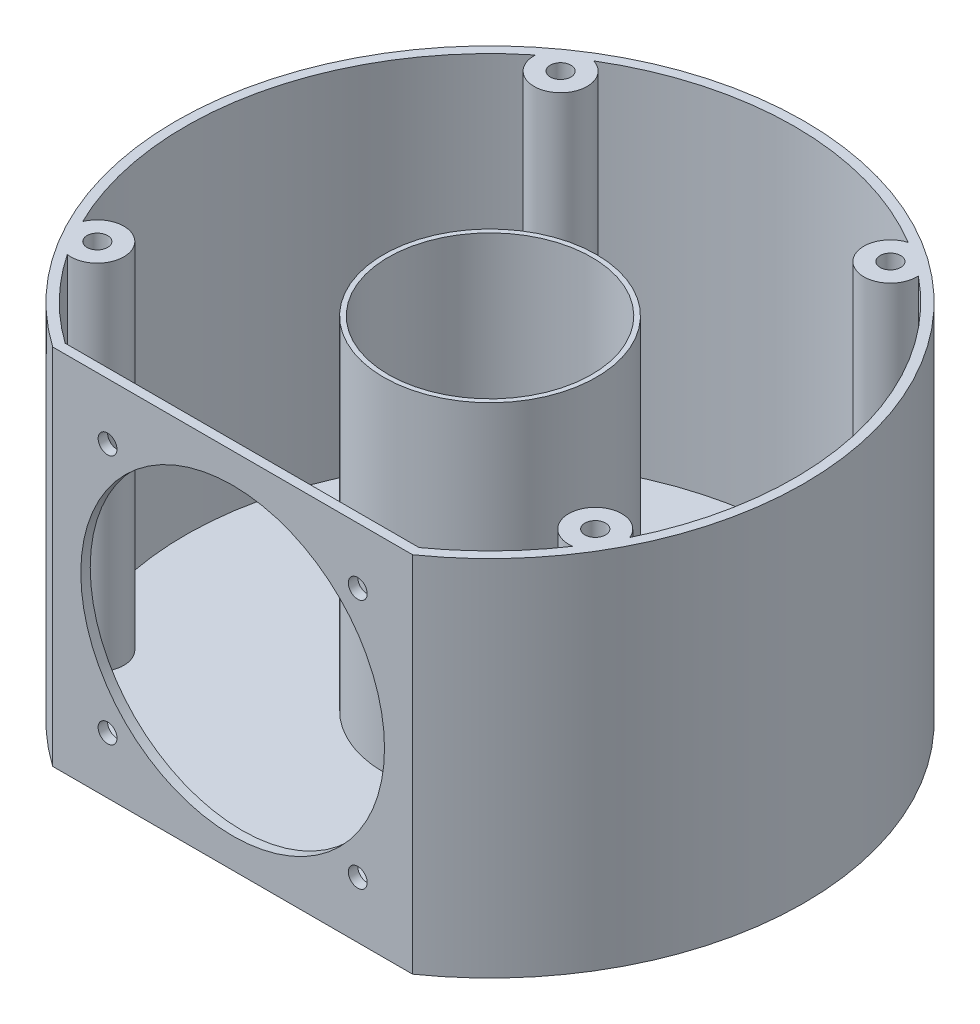
ISO-10303-21;
HEADER;
FILE_DESCRIPTION(('STEP AP214'),'2;1');
FILE_NAME('part.step','',(''),(''),'','','');
FILE_SCHEMA(('AUTOMOTIVE_DESIGN { 1 0 10303 214 1 1 1 1 }'));
ENDSEC;
DATA;
#1=APPLICATION_CONTEXT('core data for automotive mechanical design processes');
#2=APPLICATION_PROTOCOL_DEFINITION('international standard','automotive_design',2000,#1);
#3=PRODUCT_CONTEXT('',#1,'mechanical');
#4=PRODUCT('Part','Part','',(#3));
#5=PRODUCT_RELATED_PRODUCT_CATEGORY('part','',(#4));
#6=PRODUCT_DEFINITION_FORMATION('','',#4);
#7=PRODUCT_DEFINITION_CONTEXT('part definition',#1,'design');
#8=PRODUCT_DEFINITION('design','',#6,#7);
#9=PRODUCT_DEFINITION_SHAPE('','',#8);
#10=(LENGTH_UNIT() NAMED_UNIT(*) SI_UNIT(.MILLI.,.METRE.));
#11=(NAMED_UNIT(*) PLANE_ANGLE_UNIT() SI_UNIT($,.RADIAN.));
#12=(NAMED_UNIT(*) SI_UNIT($,.STERADIAN.) SOLID_ANGLE_UNIT());
#13=UNCERTAINTY_MEASURE_WITH_UNIT(LENGTH_MEASURE(1.E-05),#10,'distance_accuracy_value','');
#14=(GEOMETRIC_REPRESENTATION_CONTEXT(3) GLOBAL_UNCERTAINTY_ASSIGNED_CONTEXT((#13)) GLOBAL_UNIT_ASSIGNED_CONTEXT((#10,
#11,#12)) REPRESENTATION_CONTEXT('',''));
#15=CARTESIAN_POINT('',(0.,0.,0.));
#16=DIRECTION('',(0.,0.,1.));
#17=DIRECTION('',(1.,0.,0.));
#18=AXIS2_PLACEMENT_3D('',#15,#16,#17);
#19=CARTESIAN_POINT('',(0.,1.6,0.));
#20=DIRECTION('',(0.,-1.,0.));
#21=DIRECTION('',(0.,0.,-1.));
#22=AXIS2_PLACEMENT_3D('',#19,#20,#21);
#23=CYLINDRICAL_SURFACE('',#22,17.2417135288679);
#24=CARTESIAN_POINT('',(0.,0.,0.));
#25=DIRECTION('',(0.,1.,0.));
#26=DIRECTION('',(0.,0.,1.));
#27=AXIS2_PLACEMENT_3D('',#24,#25,#26);
#28=CIRCLE('',#27,17.2417135288679);
#29=CARTESIAN_POINT('',(0.,0.,17.2417135288679));
#30=VERTEX_POINT('',#29);
#31=EDGE_CURVE('E248',#30,#30,#28,.T.);
#32=ORIENTED_EDGE('',*,*,#31,.F.);
#33=EDGE_LOOP('',(#32));
#34=FACE_BOUND('',#33,.T.);
#35=CARTESIAN_POINT('',(0.,59.6,0.));
#36=DIRECTION('',(0.,1.,0.));
#37=DIRECTION('',(0.,0.,1.));
#38=AXIS2_PLACEMENT_3D('',#35,#36,#37);
#39=CIRCLE('',#38,17.2417135288679);
#40=CARTESIAN_POINT('',(0.,59.6,17.2417135288679));
#41=VERTEX_POINT('',#40);
#42=EDGE_CURVE('E314',#41,#41,#39,.T.);
#43=ORIENTED_EDGE('',*,*,#42,.T.);
#44=EDGE_LOOP('',(#43));
#45=FACE_BOUND('',#44,.T.);
#46=ADVANCED_FACE('F45',(#34,#45),#23,.F.);
#47=CARTESIAN_POINT('',(0.,61.6,0.));
#48=DIRECTION('',(0.,-1.,0.));
#49=DIRECTION('',(0.,0.,-1.));
#50=AXIS2_PLACEMENT_3D('',#47,#48,#49);
#51=CYLINDRICAL_SURFACE('',#50,18.0417135288679);
#52=CARTESIAN_POINT('',(0.,1.6,0.));
#53=DIRECTION('',(0.,1.,0.));
#54=DIRECTION('',(0.,0.,1.));
#55=AXIS2_PLACEMENT_3D('',#52,#53,#54);
#56=CIRCLE('',#55,18.0417135288679);
#57=CARTESIAN_POINT('',(0.,1.6,18.0417135288679));
#58=VERTEX_POINT('',#57);
#59=EDGE_CURVE('E223',#58,#58,#56,.T.);
#60=ORIENTED_EDGE('',*,*,#59,.T.);
#61=EDGE_LOOP('',(#60));
#62=FACE_BOUND('',#61,.T.);
#63=CARTESIAN_POINT('',(0.,59.6,0.));
#64=DIRECTION('',(0.,1.,0.));
#65=DIRECTION('',(0.,0.,1.));
#66=AXIS2_PLACEMENT_3D('',#63,#64,#65);
#67=CIRCLE('',#66,18.0417135288679);
#68=CARTESIAN_POINT('',(0.,59.6,18.0417135288679));
#69=VERTEX_POINT('',#68);
#70=EDGE_CURVE('E318',#69,#69,#67,.T.);
#71=ORIENTED_EDGE('',*,*,#70,.F.);
#72=EDGE_LOOP('',(#71));
#73=FACE_BOUND('',#72,.T.);
#74=ADVANCED_FACE('F304',(#62,#73),#51,.T.);
#75=CARTESIAN_POINT('',(-27.9606473281638,61.601,-39.9319427489363));
#76=DIRECTION('',(0.,-1.,0.));
#77=DIRECTION('',(0.,0.,-1.));
#78=AXIS2_PLACEMENT_3D('',#75,#76,#77);
#79=CYLINDRICAL_SURFACE('',#78,3.25);
#80=CARTESIAN_POINT('',(-27.9606473281638,0.,-39.9319427489363));
#81=DIRECTION('',(0.,1.,0.));
#82=DIRECTION('',(0.,0.,1.));
#83=AXIS2_PLACEMENT_3D('',#80,#81,#82);
#84=CIRCLE('',#83,3.25);
#85=CARTESIAN_POINT('',(-27.9606473281638,0.,-36.6819427489363));
#86=VERTEX_POINT('',#85);
#87=EDGE_CURVE('E256',#86,#86,#84,.T.);
#88=ORIENTED_EDGE('',*,*,#87,.F.);
#89=EDGE_LOOP('',(#88));
#90=FACE_BOUND('',#89,.T.);
#91=CARTESIAN_POINT('',(-27.9606473281638,57.6,-39.9319427489363));
#92=DIRECTION('',(0.,1.,0.));
#93=DIRECTION('',(0.,0.,1.));
#94=AXIS2_PLACEMENT_3D('',#91,#92,#93);
#95=CIRCLE('',#94,3.25);
#96=CARTESIAN_POINT('',(-27.9606473281638,57.6,-36.6819427489363));
#97=VERTEX_POINT('',#96);
#98=EDGE_CURVE('E49',#97,#97,#95,.T.);
#99=ORIENTED_EDGE('',*,*,#98,.T.);
#100=EDGE_LOOP('',(#99));
#101=FACE_BOUND('',#100,.T.);
#102=ADVANCED_FACE('F300',(#90,#101),#79,.F.);
#103=CARTESIAN_POINT('',(27.9606473281638,61.601,-39.9319427489363));
#104=DIRECTION('',(0.,-1.,0.));
#105=DIRECTION('',(0.,0.,-1.));
#106=AXIS2_PLACEMENT_3D('',#103,#104,#105);
#107=CYLINDRICAL_SURFACE('',#106,3.25);
#108=CARTESIAN_POINT('',(27.9606473281638,0.,-39.9319427489363));
#109=DIRECTION('',(0.,1.,0.));
#110=DIRECTION('',(0.,0.,1.));
#111=AXIS2_PLACEMENT_3D('',#108,#109,#110);
#112=CIRCLE('',#111,3.25);
#113=CARTESIAN_POINT('',(27.9606473281638,0.,-36.6819427489363));
#114=VERTEX_POINT('',#113);
#115=EDGE_CURVE('E292',#114,#114,#112,.T.);
#116=ORIENTED_EDGE('',*,*,#115,.F.);
#117=EDGE_LOOP('',(#116));
#118=FACE_BOUND('',#117,.T.);
#119=CARTESIAN_POINT('',(27.9606473281638,57.6,-39.9319427489363));
#120=DIRECTION('',(0.,1.,0.));
#121=DIRECTION('',(0.,0.,1.));
#122=AXIS2_PLACEMENT_3D('',#119,#120,#121);
#123=CIRCLE('',#122,3.25);
#124=CARTESIAN_POINT('',(27.9606473281638,57.6,-36.6819427489363));
#125=VERTEX_POINT('',#124);
#126=EDGE_CURVE('E262',#125,#125,#123,.T.);
#127=ORIENTED_EDGE('',*,*,#126,.T.);
#128=EDGE_LOOP('',(#127));
#129=FACE_BOUND('',#128,.T.);
#130=ADVANCED_FACE('F303',(#118,#129),#107,.F.);
#131=CARTESIAN_POINT('',(42.2169206365848,61.601,24.3739504938896));
#132=DIRECTION('',(0.,-1.,0.));
#133=DIRECTION('',(0.,0.,-1.));
#134=AXIS2_PLACEMENT_3D('',#131,#132,#133);
#135=CYLINDRICAL_SURFACE('',#134,3.25);
#136=CARTESIAN_POINT('',(42.2169206365848,0.,24.3739504938896));
#137=DIRECTION('',(0.,1.,0.));
#138=DIRECTION('',(0.,0.,1.));
#139=AXIS2_PLACEMENT_3D('',#136,#137,#138);
#140=CIRCLE('',#139,3.25);
#141=CARTESIAN_POINT('',(42.2169206365848,0.,27.6239504938896));
#142=VERTEX_POINT('',#141);
#143=EDGE_CURVE('E289',#142,#142,#140,.T.);
#144=ORIENTED_EDGE('',*,*,#143,.F.);
#145=EDGE_LOOP('',(#144));
#146=FACE_BOUND('',#145,.T.);
#147=CARTESIAN_POINT('',(42.2169206365848,57.6,24.3739504938896));
#148=DIRECTION('',(0.,1.,0.));
#149=DIRECTION('',(0.,0.,1.));
#150=AXIS2_PLACEMENT_3D('',#147,#148,#149);
#151=CIRCLE('',#150,3.25);
#152=CARTESIAN_POINT('',(42.2169206365848,57.6,27.6239504938896));
#153=VERTEX_POINT('',#152);
#154=EDGE_CURVE('E258',#153,#153,#151,.T.);
#155=ORIENTED_EDGE('',*,*,#154,.T.);
#156=EDGE_LOOP('',(#155));
#157=FACE_BOUND('',#156,.T.);
#158=ADVANCED_FACE('F416',(#146,#157),#135,.F.);
#159=CARTESIAN_POINT('',(-42.2169206365848,61.601,24.3739504938896));
#160=DIRECTION('',(0.,-1.,0.));
#161=DIRECTION('',(0.,0.,-1.));
#162=AXIS2_PLACEMENT_3D('',#159,#160,#161);
#163=CYLINDRICAL_SURFACE('',#162,3.25);
#164=CARTESIAN_POINT('',(-42.2169206365848,0.,24.3739504938896));
#165=DIRECTION('',(0.,1.,0.));
#166=DIRECTION('',(0.,0.,1.));
#167=AXIS2_PLACEMENT_3D('',#164,#165,#166);
#168=CIRCLE('',#167,3.25);
#169=CARTESIAN_POINT('',(-42.2169206365848,0.,27.6239504938896));
#170=VERTEX_POINT('',#169);
#171=EDGE_CURVE('E160',#170,#170,#168,.T.);
#172=ORIENTED_EDGE('',*,*,#171,.F.);
#173=EDGE_LOOP('',(#172));
#174=FACE_BOUND('',#173,.T.);
#175=CARTESIAN_POINT('',(-42.2169206365848,57.6,24.3739504938896));
#176=DIRECTION('',(0.,1.,0.));
#177=DIRECTION('',(0.,0.,1.));
#178=AXIS2_PLACEMENT_3D('',#175,#176,#177);
#179=CIRCLE('',#178,3.25);
#180=CARTESIAN_POINT('',(-42.2169206365848,57.6,27.6239504938896));
#181=VERTEX_POINT('',#180);
#182=EDGE_CURVE('E253',#181,#181,#179,.T.);
#183=ORIENTED_EDGE('',*,*,#182,.T.);
#184=EDGE_LOOP('',(#183));
#185=FACE_BOUND('',#184,.T.);
#186=ADVANCED_FACE('F413',(#174,#185),#163,.F.);
#187=CARTESIAN_POINT('',(0.,61.6,0.));
#188=DIRECTION('',(0.,-1.,0.));
#189=DIRECTION('',(0.,0.,-1.));
#190=AXIS2_PLACEMENT_3D('',#187,#188,#189);
#191=CYLINDRICAL_SURFACE('',#190,51.6479009877787);
#192=DIRECTION('',(0.,-1.,0.));
#193=VECTOR('',#192,1.);
#194=CARTESIAN_POINT('',(42.8533637080972,30.8,28.8287165053344));
#195=LINE('',#194,#193);
#196=CARTESIAN_POINT('',(42.8533637080972,1.6,28.8287165053343));
#197=VERTEX_POINT('',#196);
#198=CARTESIAN_POINT('',(42.8533637080972,61.6,28.8287165053343));
#199=VERTEX_POINT('',#198);
#200=EDGE_CURVE('E149',#197,#199,#195,.F.);
#201=ORIENTED_EDGE('',*,*,#200,.F.);
#202=CARTESIAN_POINT('',(0.,1.6,0.));
#203=DIRECTION('',(0.,1.,0.));
#204=DIRECTION('',(0.,0.,1.));
#205=AXIS2_PLACEMENT_3D('',#202,#203,#204);
#206=CIRCLE('',#205,51.6479009877787);
#207=CARTESIAN_POINT('',(30.,1.6,42.0417135288679));
#208=VERTEX_POINT('',#207);
#209=EDGE_CURVE('E136',#208,#197,#206,.T.);
#210=ORIENTED_EDGE('',*,*,#209,.F.);
#211=DIRECTION('',(0.,-1.,0.));
#212=VECTOR('',#211,1.);
#213=CARTESIAN_POINT('',(30.,61.6,42.0417135288679));
#214=LINE('',#213,#212);
#215=CARTESIAN_POINT('',(30.,61.6,42.0417135288679));
#216=VERTEX_POINT('',#215);
#217=EDGE_CURVE('E241',#216,#208,#214,.T.);
#218=ORIENTED_EDGE('',*,*,#217,.F.);
#219=CARTESIAN_POINT('',(0.,61.6,0.));
#220=DIRECTION('',(0.,1.,0.));
#221=DIRECTION('',(0.,0.,1.));
#222=AXIS2_PLACEMENT_3D('',#219,#220,#221);
#223=CIRCLE('',#222,51.6479009877787);
#224=EDGE_CURVE('E152',#216,#199,#223,.T.);
#225=ORIENTED_EDGE('',*,*,#224,.T.);
#226=EDGE_LOOP('',(#201,#210,#218,#225));
#227=FACE_BOUND('',#226,.T.);
#228=ADVANCED_FACE('F150',(#227),#191,.F.);
#229=DIRECTION('',(0.,-1.,0.));
#230=VECTOR('',#229,1.);
#231=CARTESIAN_POINT('',(46.3930827061677,30.8,22.6977433561595));
#232=LINE('',#231,#230);
#233=CARTESIAN_POINT('',(46.3930827061677,61.6,22.6977433561595));
#234=VERTEX_POINT('',#233);
#235=CARTESIAN_POINT('',(46.3930827061677,1.6,22.6977433561595));
#236=VERTEX_POINT('',#235);
#237=EDGE_CURVE('E62',#234,#236,#232,.T.);
#238=ORIENTED_EDGE('',*,*,#237,.F.);
#239=CARTESIAN_POINT('',(32.4539312786187,61.6,-40.1777055219196));
#240=VERTEX_POINT('',#239);
#241=EDGE_CURVE('E228',#234,#240,#223,.T.);
#242=ORIENTED_EDGE('',*,*,#241,.T.);
#243=DIRECTION('',(0.,-1.,0.));
#244=VECTOR('',#243,1.);
#245=CARTESIAN_POINT('',(32.4539312786187,30.8,-40.1777055219196));
#246=LINE('',#245,#244);
#247=CARTESIAN_POINT('',(32.4539312786187,1.6,-40.1777055219196));
#248=VERTEX_POINT('',#247);
#249=EDGE_CURVE('E171',#248,#240,#246,.F.);
#250=ORIENTED_EDGE('',*,*,#249,.F.);
#251=EDGE_CURVE('E145',#236,#248,#206,.T.);
#252=ORIENTED_EDGE('',*,*,#251,.F.);
#253=EDGE_LOOP('',(#238,#242,#250,#252));
#254=FACE_BOUND('',#253,.T.);
#255=ADVANCED_FACE('F503',(#254),#191,.F.);
#256=DIRECTION('',(0.,-1.,0.));
#257=VECTOR('',#256,1.);
#258=CARTESIAN_POINT('',(26.6547951716627,30.8,-44.2383043391144));
#259=LINE('',#258,#257);
#260=CARTESIAN_POINT('',(26.6547951716627,61.6,-44.2383043391144));
#261=VERTEX_POINT('',#260);
#262=CARTESIAN_POINT('',(26.6547951716627,1.6,-44.2383043391144));
#263=VERTEX_POINT('',#262);
#264=EDGE_CURVE('E169',#261,#263,#259,.T.);
#265=ORIENTED_EDGE('',*,*,#264,.F.);
#266=CARTESIAN_POINT('',(-26.6547951716627,61.6,-44.2383043391144));
#267=VERTEX_POINT('',#266);
#268=EDGE_CURVE('E487',#261,#267,#223,.T.);
#269=ORIENTED_EDGE('',*,*,#268,.T.);
#270=DIRECTION('',(0.,-1.,0.));
#271=VECTOR('',#270,1.);
#272=CARTESIAN_POINT('',(-26.6547951716627,30.8,-44.2383043391144));
#273=LINE('',#272,#271);
#274=CARTESIAN_POINT('',(-26.6547951716627,1.6,-44.2383043391144));
#275=VERTEX_POINT('',#274);
#276=EDGE_CURVE('E181',#275,#267,#273,.F.);
#277=ORIENTED_EDGE('',*,*,#276,.F.);
#278=EDGE_CURVE('E500',#263,#275,#206,.T.);
#279=ORIENTED_EDGE('',*,*,#278,.F.);
#280=EDGE_LOOP('',(#265,#269,#277,#279));
#281=FACE_BOUND('',#280,.T.);
#282=ADVANCED_FACE('F463',(#281),#191,.F.);
#283=DIRECTION('',(0.,-1.,0.));
#284=VECTOR('',#283,1.);
#285=CARTESIAN_POINT('',(-32.4539312786187,30.8,-40.1777055219196));
#286=LINE('',#285,#284);
#287=CARTESIAN_POINT('',(-32.4539312786187,61.6,-40.1777055219196));
#288=VERTEX_POINT('',#287);
#289=CARTESIAN_POINT('',(-32.4539312786187,1.6,-40.1777055219196));
#290=VERTEX_POINT('',#289);
#291=EDGE_CURVE('E179',#288,#290,#286,.T.);
#292=ORIENTED_EDGE('',*,*,#291,.F.);
#293=CARTESIAN_POINT('',(-46.3930827061677,61.6,22.6977433561595));
#294=VERTEX_POINT('',#293);
#295=EDGE_CURVE('E489',#288,#294,#223,.T.);
#296=ORIENTED_EDGE('',*,*,#295,.T.);
#297=DIRECTION('',(0.,-1.,0.));
#298=VECTOR('',#297,1.);
#299=CARTESIAN_POINT('',(-46.3930827061677,30.8,22.6977433561595));
#300=LINE('',#299,#298);
#301=CARTESIAN_POINT('',(-46.3930827061677,1.6,22.6977433561595));
#302=VERTEX_POINT('',#301);
#303=EDGE_CURVE('E191',#302,#294,#300,.F.);
#304=ORIENTED_EDGE('',*,*,#303,.F.);
#305=EDGE_CURVE('E498',#290,#302,#206,.T.);
#306=ORIENTED_EDGE('',*,*,#305,.F.);
#307=EDGE_LOOP('',(#292,#296,#304,#306));
#308=FACE_BOUND('',#307,.T.);
#309=ADVANCED_FACE('F349',(#308),#191,.F.);
#310=CARTESIAN_POINT('',(0.,1.6,43.6417135288679));
#311=DIRECTION('',(0.,0.,-1.));
#312=DIRECTION('',(-1.,0.,0.));
#313=AXIS2_PLACEMENT_3D('',#310,#311,#312);
#314=PLANE('',#313);
#315=CARTESIAN_POINT('',(0.,30.8,43.6417135288679));
#316=DIRECTION('',(0.,0.,1.));
#317=DIRECTION('',(1.,0.,0.));
#318=AXIS2_PLACEMENT_3D('',#315,#316,#317);
#319=CIRCLE('',#318,25.75);
#320=CARTESIAN_POINT('',(25.75,30.8,43.6417135288679));
#321=VERTEX_POINT('',#320);
#322=EDGE_CURVE('E196',#321,#321,#319,.T.);
#323=ORIENTED_EDGE('',*,*,#322,.F.);
#324=EDGE_LOOP('',(#323));
#325=FACE_BOUND('',#324,.T.);
#326=CARTESIAN_POINT('',(21.2132034355964,9.58679656440358,43.6417135288679));
#327=DIRECTION('',(0.,0.,1.));
#328=DIRECTION('',(1.,0.,0.));
#329=AXIS2_PLACEMENT_3D('',#326,#327,#328);
#330=CIRCLE('',#329,1.6);
#331=CARTESIAN_POINT('',(22.8132034355964,9.58679656440358,43.6417135288679));
#332=VERTEX_POINT('',#331);
#333=EDGE_CURVE('E200',#332,#332,#330,.T.);
#334=ORIENTED_EDGE('',*,*,#333,.F.);
#335=EDGE_LOOP('',(#334));
#336=FACE_BOUND('',#335,.T.);
#337=CARTESIAN_POINT('',(-21.2132034355964,9.58679656440358,43.6417135288679));
#338=DIRECTION('',(0.,0.,1.));
#339=DIRECTION('',(1.,0.,0.));
#340=AXIS2_PLACEMENT_3D('',#337,#338,#339);
#341=CIRCLE('',#340,1.6);
#342=CARTESIAN_POINT('',(-19.6132034355964,9.58679656440358,43.6417135288679));
#343=VERTEX_POINT('',#342);
#344=EDGE_CURVE('E220',#343,#343,#341,.F.);
#345=ORIENTED_EDGE('',*,*,#344,.T.);
#346=EDGE_LOOP('',(#345));
#347=FACE_BOUND('',#346,.T.);
#348=DIRECTION('',(1.,0.,0.));
#349=VECTOR('',#348,1.);
#350=CARTESIAN_POINT('',(0.,0.,43.6417135288679));
#351=LINE('',#350,#349);
#352=CARTESIAN_POINT('',(-30.5080284493855,0.,43.6417135288679));
#353=VERTEX_POINT('',#352);
#354=CARTESIAN_POINT('',(30.5080284493855,0.,43.6417135288679));
#355=VERTEX_POINT('',#354);
#356=EDGE_CURVE('E243',#353,#355,#351,.T.);
#357=ORIENTED_EDGE('',*,*,#356,.T.);
#358=DIRECTION('',(0.,-1.,0.));
#359=VECTOR('',#358,1.);
#360=CARTESIAN_POINT('',(30.5080284493855,1.6,43.6417135288679));
#361=LINE('',#360,#359);
#362=CARTESIAN_POINT('',(30.5080284493855,61.6,43.6417135288679));
#363=VERTEX_POINT('',#362);
#364=EDGE_CURVE('E12',#363,#355,#361,.T.);
#365=ORIENTED_EDGE('',*,*,#364,.F.);
#366=DIRECTION('',(1.,0.,0.));
#367=VECTOR('',#366,1.);
#368=CARTESIAN_POINT('',(0.,61.6,43.6417135288679));
#369=LINE('',#368,#367);
#370=CARTESIAN_POINT('',(-30.5080284493855,61.6,43.6417135288679));
#371=VERTEX_POINT('',#370);
#372=EDGE_CURVE('E234',#371,#363,#369,.T.);
#373=ORIENTED_EDGE('',*,*,#372,.F.);
#374=DIRECTION('',(0.,-1.,0.));
#375=VECTOR('',#374,1.);
#376=CARTESIAN_POINT('',(-30.5080284493855,1.6,43.6417135288679));
#377=LINE('',#376,#375);
#378=EDGE_CURVE('E54',#371,#353,#377,.T.);
#379=ORIENTED_EDGE('',*,*,#378,.T.);
#380=EDGE_LOOP('',(#357,#365,#373,#379));
#381=FACE_BOUND('',#380,.T.);
#382=CARTESIAN_POINT('',(21.2132034355964,52.0132034355964,43.6417135288679));
#383=DIRECTION('',(0.,0.,1.));
#384=DIRECTION('',(1.,0.,0.));
#385=AXIS2_PLACEMENT_3D('',#382,#383,#384);
#386=CIRCLE('',#385,1.6);
#387=CARTESIAN_POINT('',(22.8132034355964,52.0132034355964,43.6417135288679));
#388=VERTEX_POINT('',#387);
#389=EDGE_CURVE('E207',#388,#388,#386,.F.);
#390=ORIENTED_EDGE('',*,*,#389,.T.);
#391=EDGE_LOOP('',(#390));
#392=FACE_BOUND('',#391,.T.);
#393=CARTESIAN_POINT('',(-21.2132034355964,52.0132034355964,43.6417135288679));
#394=DIRECTION('',(0.,0.,1.));
#395=DIRECTION('',(1.,0.,0.));
#396=AXIS2_PLACEMENT_3D('',#393,#394,#395);
#397=CIRCLE('',#396,1.6);
#398=CARTESIAN_POINT('',(-19.6132034355964,52.0132034355964,43.6417135288679));
#399=VERTEX_POINT('',#398);
#400=EDGE_CURVE('E211',#399,#399,#397,.T.);
#401=ORIENTED_EDGE('',*,*,#400,.F.);
#402=EDGE_LOOP('',(#401));
#403=FACE_BOUND('',#402,.T.);
#404=ADVANCED_FACE('F47',(#325,#336,#347,#381,#392,#403),#314,.F.);
#405=CARTESIAN_POINT('',(0.,61.6,42.0417135288679));
#406=DIRECTION('',(0.,0.,-1.));
#407=DIRECTION('',(-1.,0.,0.));
#408=AXIS2_PLACEMENT_3D('',#405,#406,#407);
#409=PLANE('',#408);
#410=CARTESIAN_POINT('',(0.,30.8,42.0417135288679));
#411=DIRECTION('',(0.,0.,-1.));
#412=DIRECTION('',(-1.,0.,0.));
#413=AXIS2_PLACEMENT_3D('',#410,#411,#412);
#414=CIRCLE('',#413,25.75);
#415=CARTESIAN_POINT('',(-25.75,30.8,42.0417135288679));
#416=VERTEX_POINT('',#415);
#417=EDGE_CURVE('E193',#416,#416,#414,.F.);
#418=ORIENTED_EDGE('',*,*,#417,.T.);
#419=EDGE_LOOP('',(#418));
#420=FACE_BOUND('',#419,.T.);
#421=CARTESIAN_POINT('',(21.2132034355964,52.0132034355964,42.0417135288679));
#422=DIRECTION('',(0.,0.,-1.));
#423=DIRECTION('',(-1.,0.,0.));
#424=AXIS2_PLACEMENT_3D('',#421,#422,#423);
#425=CIRCLE('',#424,1.6);
#426=CARTESIAN_POINT('',(19.6132034355964,52.0132034355964,42.0417135288679));
#427=VERTEX_POINT('',#426);
#428=EDGE_CURVE('E208',#427,#427,#425,.T.);
#429=ORIENTED_EDGE('',*,*,#428,.F.);
#430=EDGE_LOOP('',(#429));
#431=FACE_BOUND('',#430,.T.);
#432=CARTESIAN_POINT('',(-21.2132034355964,9.58679656440358,42.0417135288679));
#433=DIRECTION('',(0.,0.,-1.));
#434=DIRECTION('',(-1.,0.,0.));
#435=AXIS2_PLACEMENT_3D('',#432,#433,#434);
#436=CIRCLE('',#435,1.6);
#437=CARTESIAN_POINT('',(-22.8132034355964,9.58679656440358,42.0417135288679));
#438=VERTEX_POINT('',#437);
#439=EDGE_CURVE('E203',#438,#438,#436,.T.);
#440=ORIENTED_EDGE('',*,*,#439,.F.);
#441=EDGE_LOOP('',(#440));
#442=FACE_BOUND('',#441,.T.);
#443=DIRECTION('',(1.,0.,0.));
#444=VECTOR('',#443,1.);
#445=CARTESIAN_POINT('',(0.,1.6,42.0417135288679));
#446=LINE('',#445,#444);
#447=CARTESIAN_POINT('',(-30.,1.6,42.0417135288679));
#448=VERTEX_POINT('',#447);
#449=EDGE_CURVE('E142',#448,#208,#446,.T.);
#450=ORIENTED_EDGE('',*,*,#449,.F.);
#451=DIRECTION('',(0.,-1.,0.));
#452=VECTOR('',#451,1.);
#453=CARTESIAN_POINT('',(-30.,61.6,42.0417135288679));
#454=LINE('',#453,#452);
#455=CARTESIAN_POINT('',(-30.,61.6,42.0417135288679));
#456=VERTEX_POINT('',#455);
#457=EDGE_CURVE('E236',#456,#448,#454,.T.);
#458=ORIENTED_EDGE('',*,*,#457,.F.);
#459=DIRECTION('',(1.,0.,0.));
#460=VECTOR('',#459,1.);
#461=CARTESIAN_POINT('',(0.,61.6,42.0417135288679));
#462=LINE('',#461,#460);
#463=EDGE_CURVE('E227',#456,#216,#462,.T.);
#464=ORIENTED_EDGE('',*,*,#463,.T.);
#465=ORIENTED_EDGE('',*,*,#217,.T.);
#466=EDGE_LOOP('',(#450,#458,#464,#465));
#467=FACE_BOUND('',#466,.T.);
#468=CARTESIAN_POINT('',(21.2132034355964,9.58679656440358,42.0417135288679));
#469=DIRECTION('',(0.,0.,-1.));
#470=DIRECTION('',(-1.,0.,0.));
#471=AXIS2_PLACEMENT_3D('',#468,#469,#470);
#472=CIRCLE('',#471,1.6);
#473=CARTESIAN_POINT('',(19.6132034355964,9.58679656440358,42.0417135288679));
#474=VERTEX_POINT('',#473);
#475=EDGE_CURVE('E204',#474,#474,#472,.F.);
#476=ORIENTED_EDGE('',*,*,#475,.T.);
#477=EDGE_LOOP('',(#476));
#478=FACE_BOUND('',#477,.T.);
#479=CARTESIAN_POINT('',(-21.2132034355964,52.0132034355964,42.0417135288679));
#480=DIRECTION('',(0.,0.,-1.));
#481=DIRECTION('',(-1.,0.,0.));
#482=AXIS2_PLACEMENT_3D('',#479,#480,#481);
#483=CIRCLE('',#482,1.6);
#484=CARTESIAN_POINT('',(-22.8132034355964,52.0132034355964,42.0417135288679));
#485=VERTEX_POINT('',#484);
#486=EDGE_CURVE('E199',#485,#485,#483,.F.);
#487=ORIENTED_EDGE('',*,*,#486,.T.);
#488=EDGE_LOOP('',(#487));
#489=FACE_BOUND('',#488,.T.);
#490=ADVANCED_FACE('F341',(#420,#431,#442,#467,#478,#489),#409,.T.);
#491=CARTESIAN_POINT('',(0.,1.6,0.));
#492=DIRECTION('',(0.,-1.,0.));
#493=DIRECTION('',(0.,0.,-1.));
#494=AXIS2_PLACEMENT_3D('',#491,#492,#493);
#495=CYLINDRICAL_SURFACE('',#494,53.2479009877787);
#496=ORIENTED_EDGE('',*,*,#378,.F.);
#497=CARTESIAN_POINT('',(0.,61.6,0.));
#498=DIRECTION('',(0.,1.,0.));
#499=DIRECTION('',(0.,0.,1.));
#500=AXIS2_PLACEMENT_3D('',#497,#498,#499);
#501=CIRCLE('',#500,53.2479009877787);
#502=EDGE_CURVE('E232',#363,#371,#501,.T.);
#503=ORIENTED_EDGE('',*,*,#502,.F.);
#504=ORIENTED_EDGE('',*,*,#364,.T.);
#505=CARTESIAN_POINT('',(0.,0.,0.));
#506=DIRECTION('',(0.,1.,0.));
#507=DIRECTION('',(0.,0.,1.));
#508=AXIS2_PLACEMENT_3D('',#505,#506,#507);
#509=CIRCLE('',#508,53.2479009877787);
#510=EDGE_CURVE('E246',#355,#353,#509,.T.);
#511=ORIENTED_EDGE('',*,*,#510,.T.);
#512=EDGE_LOOP('',(#496,#503,#504,#511));
#513=FACE_BOUND('',#512,.T.);
#514=ADVANCED_FACE('F344',(#513),#495,.T.);
#515=CARTESIAN_POINT('',(0.,1.6,0.));
#516=DIRECTION('',(0.,1.,0.));
#517=DIRECTION('',(0.,0.,1.));
#518=AXIS2_PLACEMENT_3D('',#515,#516,#517);
#519=PLANE('',#518);
#520=CARTESIAN_POINT('',(42.2169206365848,1.6,24.3739504938896));
#521=DIRECTION('',(0.,1.,0.));
#522=DIRECTION('',(0.,0.,1.));
#523=AXIS2_PLACEMENT_3D('',#520,#521,#522);
#524=CIRCLE('',#523,4.5);
#525=EDGE_CURVE('E140',#236,#197,#524,.T.);
#526=ORIENTED_EDGE('',*,*,#525,.F.);
#527=ORIENTED_EDGE('',*,*,#251,.T.);
#528=CARTESIAN_POINT('',(27.9606473281638,1.6,-39.9319427489363));
#529=DIRECTION('',(0.,1.,0.));
#530=DIRECTION('',(0.,0.,1.));
#531=AXIS2_PLACEMENT_3D('',#528,#529,#530);
#532=CIRCLE('',#531,4.5);
#533=EDGE_CURVE('E166',#263,#248,#532,.T.);
#534=ORIENTED_EDGE('',*,*,#533,.F.);
#535=ORIENTED_EDGE('',*,*,#278,.T.);
#536=CARTESIAN_POINT('',(-27.9606473281638,1.6,-39.9319427489363));
#537=DIRECTION('',(0.,1.,0.));
#538=DIRECTION('',(0.,0.,1.));
#539=AXIS2_PLACEMENT_3D('',#536,#537,#538);
#540=CIRCLE('',#539,4.50000000000001);
#541=EDGE_CURVE('E176',#290,#275,#540,.T.);
#542=ORIENTED_EDGE('',*,*,#541,.F.);
#543=ORIENTED_EDGE('',*,*,#305,.T.);
#544=CARTESIAN_POINT('',(-42.2169206365848,1.6,24.3739504938896));
#545=DIRECTION('',(0.,1.,0.));
#546=DIRECTION('',(0.,0.,1.));
#547=AXIS2_PLACEMENT_3D('',#544,#545,#546);
#548=CIRCLE('',#547,4.5);
#549=CARTESIAN_POINT('',(-42.8533637080971,1.6,28.8287165053344));
#550=VERTEX_POINT('',#549);
#551=EDGE_CURVE('E188',#550,#302,#548,.T.);
#552=ORIENTED_EDGE('',*,*,#551,.F.);
#553=EDGE_CURVE('E147',#550,#448,#206,.T.);
#554=ORIENTED_EDGE('',*,*,#553,.T.);
#555=ORIENTED_EDGE('',*,*,#449,.T.);
#556=ORIENTED_EDGE('',*,*,#209,.T.);
#557=EDGE_LOOP('',(#526,#527,#534,#535,#542,#543,#552,#554,#555,#556));
#558=FACE_BOUND('',#557,.T.);
#559=ORIENTED_EDGE('',*,*,#59,.F.);
#560=EDGE_LOOP('',(#559));
#561=FACE_BOUND('',#560,.T.);
#562=ADVANCED_FACE('F138',(#558,#561),#519,.T.);
#563=CARTESIAN_POINT('',(0.,0.,0.));
#564=DIRECTION('',(0.,1.,0.));
#565=DIRECTION('',(0.,0.,1.));
#566=AXIS2_PLACEMENT_3D('',#563,#564,#565);
#567=PLANE('',#566);
#568=ORIENTED_EDGE('',*,*,#171,.T.);
#569=EDGE_LOOP('',(#568));
#570=FACE_BOUND('',#569,.T.);
#571=ORIENTED_EDGE('',*,*,#143,.T.);
#572=EDGE_LOOP('',(#571));
#573=FACE_BOUND('',#572,.T.);
#574=ORIENTED_EDGE('',*,*,#115,.T.);
#575=EDGE_LOOP('',(#574));
#576=FACE_BOUND('',#575,.T.);
#577=ORIENTED_EDGE('',*,*,#87,.T.);
#578=EDGE_LOOP('',(#577));
#579=FACE_BOUND('',#578,.T.);
#580=ORIENTED_EDGE('',*,*,#356,.F.);
#581=ORIENTED_EDGE('',*,*,#510,.F.);
#582=EDGE_LOOP('',(#580,#581));
#583=FACE_BOUND('',#582,.T.);
#584=ORIENTED_EDGE('',*,*,#31,.T.);
#585=EDGE_LOOP('',(#584));
#586=FACE_BOUND('',#585,.T.);
#587=ADVANCED_FACE('F297',(#570,#573,#576,#579,#583,#586),#567,.F.);
#588=DIRECTION('',(0.,-1.,0.));
#589=VECTOR('',#588,1.);
#590=CARTESIAN_POINT('',(-42.8533637080972,30.8,28.8287165053344));
#591=LINE('',#590,#589);
#592=CARTESIAN_POINT('',(-42.8533637080972,61.6,28.8287165053343));
#593=VERTEX_POINT('',#592);
#594=EDGE_CURVE('E186',#593,#550,#591,.T.);
#595=ORIENTED_EDGE('',*,*,#594,.F.);
#596=EDGE_CURVE('E229',#593,#456,#223,.T.);
#597=ORIENTED_EDGE('',*,*,#596,.T.);
#598=ORIENTED_EDGE('',*,*,#457,.T.);
#599=ORIENTED_EDGE('',*,*,#553,.F.);
#600=EDGE_LOOP('',(#595,#597,#598,#599));
#601=FACE_BOUND('',#600,.T.);
#602=ADVANCED_FACE('F339',(#601),#191,.F.);
#603=CARTESIAN_POINT('',(0.,61.6,0.));
#604=DIRECTION('',(0.,1.,0.));
#605=DIRECTION('',(0.,0.,1.));
#606=AXIS2_PLACEMENT_3D('',#603,#604,#605);
#607=PLANE('',#606);
#608=ORIENTED_EDGE('',*,*,#502,.T.);
#609=ORIENTED_EDGE('',*,*,#372,.T.);
#610=EDGE_LOOP('',(#608,#609));
#611=FACE_BOUND('',#610,.T.);
#612=CARTESIAN_POINT('',(-27.9606473281638,61.6,-39.9319427489363));
#613=DIRECTION('',(0.,1.,0.));
#614=DIRECTION('',(0.,0.,1.));
#615=AXIS2_PLACEMENT_3D('',#612,#613,#614);
#616=CIRCLE('',#615,4.50000000000001);
#617=EDGE_CURVE('E173',#267,#288,#616,.F.);
#618=ORIENTED_EDGE('',*,*,#617,.F.);
#619=ORIENTED_EDGE('',*,*,#268,.F.);
#620=CARTESIAN_POINT('',(27.9606473281638,61.6,-39.9319427489363));
#621=DIRECTION('',(0.,1.,0.));
#622=DIRECTION('',(0.,0.,1.));
#623=AXIS2_PLACEMENT_3D('',#620,#621,#622);
#624=CIRCLE('',#623,4.5);
#625=EDGE_CURVE('E154',#240,#261,#624,.F.);
#626=ORIENTED_EDGE('',*,*,#625,.F.);
#627=ORIENTED_EDGE('',*,*,#241,.F.);
#628=CARTESIAN_POINT('',(42.2169206365848,61.6,24.3739504938896));
#629=DIRECTION('',(0.,1.,0.));
#630=DIRECTION('',(0.,0.,1.));
#631=AXIS2_PLACEMENT_3D('',#628,#629,#630);
#632=CIRCLE('',#631,4.5);
#633=EDGE_CURVE('E157',#199,#234,#632,.F.);
#634=ORIENTED_EDGE('',*,*,#633,.F.);
#635=ORIENTED_EDGE('',*,*,#224,.F.);
#636=ORIENTED_EDGE('',*,*,#463,.F.);
#637=ORIENTED_EDGE('',*,*,#596,.F.);
#638=CARTESIAN_POINT('',(-42.2169206365848,61.6,24.3739504938896));
#639=DIRECTION('',(0.,1.,0.));
#640=DIRECTION('',(0.,0.,1.));
#641=AXIS2_PLACEMENT_3D('',#638,#639,#640);
#642=CIRCLE('',#641,4.5);
#643=EDGE_CURVE('E183',#294,#593,#642,.F.);
#644=ORIENTED_EDGE('',*,*,#643,.F.);
#645=ORIENTED_EDGE('',*,*,#295,.F.);
#646=EDGE_LOOP('',(#618,#619,#626,#627,#634,#635,#636,#637,#644,#645));
#647=FACE_BOUND('',#646,.T.);
#648=CARTESIAN_POINT('',(-42.2169206365848,61.6,24.3739504938896));
#649=DIRECTION('',(0.,1.,0.));
#650=DIRECTION('',(0.,0.,1.));
#651=AXIS2_PLACEMENT_3D('',#648,#649,#650);
#652=CIRCLE('',#651,1.75);
#653=CARTESIAN_POINT('',(-42.2169206365848,61.6,26.1239504938896));
#654=VERTEX_POINT('',#653);
#655=EDGE_CURVE('E260',#654,#654,#652,.T.);
#656=ORIENTED_EDGE('',*,*,#655,.F.);
#657=EDGE_LOOP('',(#656));
#658=FACE_BOUND('',#657,.T.);
#659=CARTESIAN_POINT('',(42.2169206365848,61.6,24.3739504938896));
#660=DIRECTION('',(0.,1.,0.));
#661=DIRECTION('',(0.,0.,1.));
#662=AXIS2_PLACEMENT_3D('',#659,#660,#661);
#663=CIRCLE('',#662,1.75);
#664=CARTESIAN_POINT('',(42.2169206365848,61.6,26.1239504938896));
#665=VERTEX_POINT('',#664);
#666=EDGE_CURVE('E264',#665,#665,#663,.T.);
#667=ORIENTED_EDGE('',*,*,#666,.F.);
#668=EDGE_LOOP('',(#667));
#669=FACE_BOUND('',#668,.T.);
#670=CARTESIAN_POINT('',(27.9606473281638,61.6,-39.9319427489363));
#671=DIRECTION('',(0.,1.,0.));
#672=DIRECTION('',(0.,0.,1.));
#673=AXIS2_PLACEMENT_3D('',#670,#671,#672);
#674=CIRCLE('',#673,1.75);
#675=CARTESIAN_POINT('',(27.9606473281638,61.6,-38.1819427489363));
#676=VERTEX_POINT('',#675);
#677=EDGE_CURVE('E271',#676,#676,#674,.T.);
#678=ORIENTED_EDGE('',*,*,#677,.F.);
#679=EDGE_LOOP('',(#678));
#680=FACE_BOUND('',#679,.T.);
#681=CARTESIAN_POINT('',(-27.9606473281638,61.6,-39.9319427489363));
#682=DIRECTION('',(0.,1.,0.));
#683=DIRECTION('',(0.,0.,1.));
#684=AXIS2_PLACEMENT_3D('',#681,#682,#683);
#685=CIRCLE('',#684,1.75);
#686=CARTESIAN_POINT('',(-27.9606473281638,61.6,-38.1819427489363));
#687=VERTEX_POINT('',#686);
#688=EDGE_CURVE('E278',#687,#687,#685,.T.);
#689=ORIENTED_EDGE('',*,*,#688,.F.);
#690=EDGE_LOOP('',(#689));
#691=FACE_BOUND('',#690,.T.);
#692=ADVANCED_FACE('F336',(#611,#647,#658,#669,#680,#691),#607,.T.);
#693=CARTESIAN_POINT('',(-21.2132034355964,9.58679656440358,-53.2489009877787));
#694=DIRECTION('',(0.,0.,1.));
#695=DIRECTION('',(1.,0.,0.));
#696=AXIS2_PLACEMENT_3D('',#693,#694,#695);
#697=CYLINDRICAL_SURFACE('',#696,1.6);
#698=ORIENTED_EDGE('',*,*,#439,.T.);
#699=EDGE_LOOP('',(#698));
#700=FACE_BOUND('',#699,.T.);
#701=ORIENTED_EDGE('',*,*,#344,.F.);
#702=EDGE_LOOP('',(#701));
#703=FACE_BOUND('',#702,.T.);
#704=ADVANCED_FACE('F334',(#700,#703),#697,.F.);
#705=CARTESIAN_POINT('',(21.2132034355964,9.58679656440358,-53.2489009877787));
#706=DIRECTION('',(0.,0.,1.));
#707=DIRECTION('',(1.,0.,0.));
#708=AXIS2_PLACEMENT_3D('',#705,#706,#707);
#709=CYLINDRICAL_SURFACE('',#708,1.6);
#710=ORIENTED_EDGE('',*,*,#475,.F.);
#711=EDGE_LOOP('',(#710));
#712=FACE_BOUND('',#711,.T.);
#713=ORIENTED_EDGE('',*,*,#333,.T.);
#714=EDGE_LOOP('',(#713));
#715=FACE_BOUND('',#714,.T.);
#716=ADVANCED_FACE('F443',(#712,#715),#709,.F.);
#717=CARTESIAN_POINT('',(21.2132034355964,52.0132034355964,-53.2489009877787));
#718=DIRECTION('',(0.,0.,1.));
#719=DIRECTION('',(1.,0.,0.));
#720=AXIS2_PLACEMENT_3D('',#717,#718,#719);
#721=CYLINDRICAL_SURFACE('',#720,1.6);
#722=ORIENTED_EDGE('',*,*,#428,.T.);
#723=EDGE_LOOP('',(#722));
#724=FACE_BOUND('',#723,.T.);
#725=ORIENTED_EDGE('',*,*,#389,.F.);
#726=EDGE_LOOP('',(#725));
#727=FACE_BOUND('',#726,.T.);
#728=ADVANCED_FACE('F446',(#724,#727),#721,.F.);
#729=CARTESIAN_POINT('',(-21.2132034355964,52.0132034355964,-53.2489009877787));
#730=DIRECTION('',(0.,0.,1.));
#731=DIRECTION('',(1.,0.,0.));
#732=AXIS2_PLACEMENT_3D('',#729,#730,#731);
#733=CYLINDRICAL_SURFACE('',#732,1.6);
#734=ORIENTED_EDGE('',*,*,#486,.F.);
#735=EDGE_LOOP('',(#734));
#736=FACE_BOUND('',#735,.T.);
#737=ORIENTED_EDGE('',*,*,#400,.T.);
#738=EDGE_LOOP('',(#737));
#739=FACE_BOUND('',#738,.T.);
#740=ADVANCED_FACE('F441',(#736,#739),#733,.F.);
#741=CARTESIAN_POINT('',(0.,30.8,-53.2489009877787));
#742=DIRECTION('',(0.,0.,1.));
#743=DIRECTION('',(1.,0.,0.));
#744=AXIS2_PLACEMENT_3D('',#741,#742,#743);
#745=CYLINDRICAL_SURFACE('',#744,25.75);
#746=ORIENTED_EDGE('',*,*,#417,.F.);
#747=EDGE_LOOP('',(#746));
#748=FACE_BOUND('',#747,.T.);
#749=ORIENTED_EDGE('',*,*,#322,.T.);
#750=EDGE_LOOP('',(#749));
#751=FACE_BOUND('',#750,.T.);
#752=ADVANCED_FACE('F437',(#748,#751),#745,.F.);
#753=CARTESIAN_POINT('',(-42.2169206365848,74.3279220613579,24.3739504938896));
#754=DIRECTION('',(0.,-1.,0.));
#755=DIRECTION('',(0.,0.,-1.));
#756=AXIS2_PLACEMENT_3D('',#753,#754,#755);
#757=CYLINDRICAL_SURFACE('',#756,4.5);
#758=ORIENTED_EDGE('',*,*,#594,.T.);
#759=ORIENTED_EDGE('',*,*,#551,.T.);
#760=ORIENTED_EDGE('',*,*,#303,.T.);
#761=ORIENTED_EDGE('',*,*,#643,.T.);
#762=EDGE_LOOP('',(#758,#759,#760,#761));
#763=FACE_BOUND('',#762,.T.);
#764=ADVANCED_FACE('F433',(#763),#757,.T.);
#765=CARTESIAN_POINT('',(-27.9606473281638,74.3279220613579,-39.9319427489363));
#766=DIRECTION('',(0.,-1.,0.));
#767=DIRECTION('',(0.,0.,-1.));
#768=AXIS2_PLACEMENT_3D('',#765,#766,#767);
#769=CYLINDRICAL_SURFACE('',#768,4.50000000000001);
#770=ORIENTED_EDGE('',*,*,#291,.T.);
#771=ORIENTED_EDGE('',*,*,#541,.T.);
#772=ORIENTED_EDGE('',*,*,#276,.T.);
#773=ORIENTED_EDGE('',*,*,#617,.T.);
#774=EDGE_LOOP('',(#770,#771,#772,#773));
#775=FACE_BOUND('',#774,.T.);
#776=ADVANCED_FACE('F429',(#775),#769,.T.);
#777=CARTESIAN_POINT('',(27.9606473281638,74.3279220613579,-39.9319427489363));
#778=DIRECTION('',(0.,-1.,0.));
#779=DIRECTION('',(0.,0.,-1.));
#780=AXIS2_PLACEMENT_3D('',#777,#778,#779);
#781=CYLINDRICAL_SURFACE('',#780,4.5);
#782=ORIENTED_EDGE('',*,*,#264,.T.);
#783=ORIENTED_EDGE('',*,*,#533,.T.);
#784=ORIENTED_EDGE('',*,*,#249,.T.);
#785=ORIENTED_EDGE('',*,*,#625,.T.);
#786=EDGE_LOOP('',(#782,#783,#784,#785));
#787=FACE_BOUND('',#786,.T.);
#788=ADVANCED_FACE('F426',(#787),#781,.T.);
#789=CARTESIAN_POINT('',(42.2169206365848,74.3279220613579,24.3739504938896));
#790=DIRECTION('',(0.,-1.,0.));
#791=DIRECTION('',(0.,0.,-1.));
#792=AXIS2_PLACEMENT_3D('',#789,#790,#791);
#793=CYLINDRICAL_SURFACE('',#792,4.5);
#794=ORIENTED_EDGE('',*,*,#237,.T.);
#795=ORIENTED_EDGE('',*,*,#525,.T.);
#796=ORIENTED_EDGE('',*,*,#200,.T.);
#797=ORIENTED_EDGE('',*,*,#633,.T.);
#798=EDGE_LOOP('',(#794,#795,#796,#797));
#799=FACE_BOUND('',#798,.T.);
#800=ADVANCED_FACE('F156',(#799),#793,.T.);
#801=CARTESIAN_POINT('',(-42.2169206365848,57.6,24.3739504938896));
#802=DIRECTION('',(0.,1.,0.));
#803=DIRECTION('',(0.,0.,1.));
#804=AXIS2_PLACEMENT_3D('',#801,#802,#803);
#805=PLANE('',#804);
#806=CARTESIAN_POINT('',(-42.2169206365848,57.6,24.3739504938896));
#807=DIRECTION('',(0.,1.,0.));
#808=DIRECTION('',(0.,0.,1.));
#809=AXIS2_PLACEMENT_3D('',#806,#807,#808);
#810=CIRCLE('',#809,1.75);
#811=CARTESIAN_POINT('',(-42.2169206365848,57.6,26.1239504938896));
#812=VERTEX_POINT('',#811);
#813=EDGE_CURVE('E257',#812,#812,#810,.T.);
#814=ORIENTED_EDGE('',*,*,#813,.T.);
#815=EDGE_LOOP('',(#814));
#816=FACE_BOUND('',#815,.T.);
#817=ORIENTED_EDGE('',*,*,#182,.F.);
#818=EDGE_LOOP('',(#817));
#819=FACE_BOUND('',#818,.T.);
#820=ADVANCED_FACE('F408',(#816,#819),#805,.F.);
#821=CARTESIAN_POINT('',(-42.2169206365848,57.6,24.3739504938896));
#822=DIRECTION('',(0.,1.,0.));
#823=DIRECTION('',(0.,0.,1.));
#824=AXIS2_PLACEMENT_3D('',#821,#822,#823);
#825=CYLINDRICAL_SURFACE('',#824,1.75);
#826=ORIENTED_EDGE('',*,*,#813,.F.);
#827=EDGE_LOOP('',(#826));
#828=FACE_BOUND('',#827,.T.);
#829=ORIENTED_EDGE('',*,*,#655,.T.);
#830=EDGE_LOOP('',(#829));
#831=FACE_BOUND('',#830,.T.);
#832=ADVANCED_FACE('F404',(#828,#831),#825,.F.);
#833=CARTESIAN_POINT('',(42.2169206365848,57.6,24.3739504938896));
#834=DIRECTION('',(0.,1.,0.));
#835=DIRECTION('',(0.,0.,1.));
#836=AXIS2_PLACEMENT_3D('',#833,#834,#835);
#837=PLANE('',#836);
#838=CARTESIAN_POINT('',(42.2169206365848,57.6,24.3739504938896));
#839=DIRECTION('',(0.,1.,0.));
#840=DIRECTION('',(0.,0.,1.));
#841=AXIS2_PLACEMENT_3D('',#838,#839,#840);
#842=CIRCLE('',#841,1.75);
#843=CARTESIAN_POINT('',(42.2169206365848,57.6,26.1239504938896));
#844=VERTEX_POINT('',#843);
#845=EDGE_CURVE('E261',#844,#844,#842,.T.);
#846=ORIENTED_EDGE('',*,*,#845,.T.);
#847=EDGE_LOOP('',(#846));
#848=FACE_BOUND('',#847,.T.);
#849=ORIENTED_EDGE('',*,*,#154,.F.);
#850=EDGE_LOOP('',(#849));
#851=FACE_BOUND('',#850,.T.);
#852=ADVANCED_FACE('F400',(#848,#851),#837,.F.);
#853=CARTESIAN_POINT('',(42.2169206365848,57.6,24.3739504938896));
#854=DIRECTION('',(0.,1.,0.));
#855=DIRECTION('',(0.,0.,1.));
#856=AXIS2_PLACEMENT_3D('',#853,#854,#855);
#857=CYLINDRICAL_SURFACE('',#856,1.75);
#858=ORIENTED_EDGE('',*,*,#845,.F.);
#859=EDGE_LOOP('',(#858));
#860=FACE_BOUND('',#859,.T.);
#861=ORIENTED_EDGE('',*,*,#666,.T.);
#862=EDGE_LOOP('',(#861));
#863=FACE_BOUND('',#862,.T.);
#864=ADVANCED_FACE('F397',(#860,#863),#857,.F.);
#865=CARTESIAN_POINT('',(27.9606473281638,57.6,-39.9319427489363));
#866=DIRECTION('',(0.,1.,0.));
#867=DIRECTION('',(0.,0.,1.));
#868=AXIS2_PLACEMENT_3D('',#865,#866,#867);
#869=PLANE('',#868);
#870=CARTESIAN_POINT('',(27.9606473281638,57.6,-39.9319427489363));
#871=DIRECTION('',(0.,1.,0.));
#872=DIRECTION('',(0.,0.,1.));
#873=AXIS2_PLACEMENT_3D('',#870,#871,#872);
#874=CIRCLE('',#873,1.75);
#875=CARTESIAN_POINT('',(27.9606473281638,57.6,-38.1819427489363));
#876=VERTEX_POINT('',#875);
#877=EDGE_CURVE('E265',#876,#876,#874,.T.);
#878=ORIENTED_EDGE('',*,*,#877,.T.);
#879=EDGE_LOOP('',(#878));
#880=FACE_BOUND('',#879,.T.);
#881=ORIENTED_EDGE('',*,*,#126,.F.);
#882=EDGE_LOOP('',(#881));
#883=FACE_BOUND('',#882,.T.);
#884=ADVANCED_FACE('F393',(#880,#883),#869,.F.);
#885=CARTESIAN_POINT('',(27.9606473281638,57.6,-39.9319427489363));
#886=DIRECTION('',(0.,1.,0.));
#887=DIRECTION('',(0.,0.,1.));
#888=AXIS2_PLACEMENT_3D('',#885,#886,#887);
#889=CYLINDRICAL_SURFACE('',#888,1.75);
#890=ORIENTED_EDGE('',*,*,#877,.F.);
#891=EDGE_LOOP('',(#890));
#892=FACE_BOUND('',#891,.T.);
#893=ORIENTED_EDGE('',*,*,#677,.T.);
#894=EDGE_LOOP('',(#893));
#895=FACE_BOUND('',#894,.T.);
#896=ADVANCED_FACE('F388',(#892,#895),#889,.F.);
#897=CARTESIAN_POINT('',(-27.9606473281638,57.6,-39.9319427489363));
#898=DIRECTION('',(0.,1.,0.));
#899=DIRECTION('',(0.,0.,1.));
#900=AXIS2_PLACEMENT_3D('',#897,#898,#899);
#901=PLANE('',#900);
#902=CARTESIAN_POINT('',(-27.9606473281638,57.6,-39.9319427489363));
#903=DIRECTION('',(0.,1.,0.));
#904=DIRECTION('',(0.,0.,1.));
#905=AXIS2_PLACEMENT_3D('',#902,#903,#904);
#906=CIRCLE('',#905,1.75);
#907=CARTESIAN_POINT('',(-27.9606473281638,57.6,-38.1819427489363));
#908=VERTEX_POINT('',#907);
#909=EDGE_CURVE('E309',#908,#908,#906,.T.);
#910=ORIENTED_EDGE('',*,*,#909,.T.);
#911=EDGE_LOOP('',(#910));
#912=FACE_BOUND('',#911,.T.);
#913=ORIENTED_EDGE('',*,*,#98,.F.);
#914=EDGE_LOOP('',(#913));
#915=FACE_BOUND('',#914,.T.);
#916=ADVANCED_FACE('F379',(#912,#915),#901,.F.);
#917=CARTESIAN_POINT('',(-27.9606473281638,57.6,-39.9319427489363));
#918=DIRECTION('',(0.,1.,0.));
#919=DIRECTION('',(0.,0.,1.));
#920=AXIS2_PLACEMENT_3D('',#917,#918,#919);
#921=CYLINDRICAL_SURFACE('',#920,1.75);
#922=ORIENTED_EDGE('',*,*,#909,.F.);
#923=EDGE_LOOP('',(#922));
#924=FACE_BOUND('',#923,.T.);
#925=ORIENTED_EDGE('',*,*,#688,.T.);
#926=EDGE_LOOP('',(#925));
#927=FACE_BOUND('',#926,.T.);
#928=ADVANCED_FACE('F377',(#924,#927),#921,.F.);
#929=CARTESIAN_POINT('',(0.,59.6,0.));
#930=DIRECTION('',(0.,1.,0.));
#931=DIRECTION('',(0.,0.,1.));
#932=AXIS2_PLACEMENT_3D('',#929,#930,#931);
#933=PLANE('',#932);
#934=ORIENTED_EDGE('',*,*,#42,.F.);
#935=EDGE_LOOP('',(#934));
#936=FACE_BOUND('',#935,.T.);
#937=ORIENTED_EDGE('',*,*,#70,.T.);
#938=EDGE_LOOP('',(#937));
#939=FACE_BOUND('',#938,.T.);
#940=ADVANCED_FACE('F322',(#936,#939),#933,.T.);
#941=CLOSED_SHELL('',(#46,#74,#102,#130,#158,#186,#228,#255,#282,#309,#404,#490,#514,#562,#587,
#602,#692,#704,#716,#728,#740,#752,#764,#776,#788,#800,#820,#832,#852,#864,#884,#896,#916,#928,#940));
#942=MANIFOLD_SOLID_BREP('B2',#941);
#943=ADVANCED_BREP_SHAPE_REPRESENTATION('',(#18,#942),#14);
#944=SHAPE_DEFINITION_REPRESENTATION(#9,#943);
ENDSEC;
END-ISO-10303-21;
